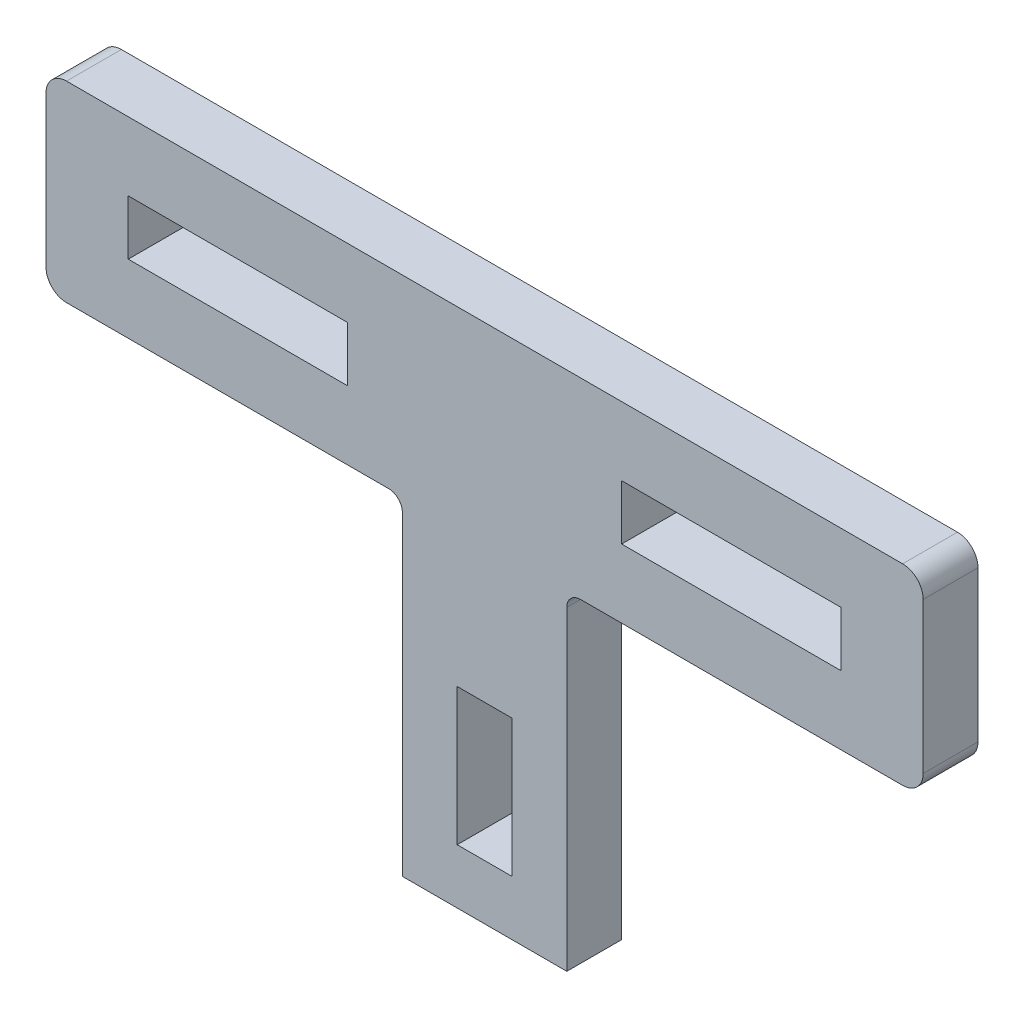
ISO-10303-21;
HEADER;
FILE_DESCRIPTION(('STEP AP214'),'2;1');
FILE_NAME('part.step','',(''),(''),'','','');
FILE_SCHEMA(('AUTOMOTIVE_DESIGN { 1 0 10303 214 1 1 1 1 }'));
ENDSEC;
DATA;
#1=APPLICATION_CONTEXT('core data for automotive mechanical design processes');
#2=APPLICATION_PROTOCOL_DEFINITION('international standard','automotive_design',2000,#1);
#3=PRODUCT_CONTEXT('',#1,'mechanical');
#4=PRODUCT('Part','Part','',(#3));
#5=PRODUCT_RELATED_PRODUCT_CATEGORY('part','',(#4));
#6=PRODUCT_DEFINITION_FORMATION('','',#4);
#7=PRODUCT_DEFINITION_CONTEXT('part definition',#1,'design');
#8=PRODUCT_DEFINITION('design','',#6,#7);
#9=PRODUCT_DEFINITION_SHAPE('','',#8);
#10=(LENGTH_UNIT() NAMED_UNIT(*) SI_UNIT(.MILLI.,.METRE.));
#11=(NAMED_UNIT(*) PLANE_ANGLE_UNIT() SI_UNIT($,.RADIAN.));
#12=(NAMED_UNIT(*) SI_UNIT($,.STERADIAN.) SOLID_ANGLE_UNIT());
#13=UNCERTAINTY_MEASURE_WITH_UNIT(LENGTH_MEASURE(1.E-05),#10,'distance_accuracy_value','');
#14=(GEOMETRIC_REPRESENTATION_CONTEXT(3) GLOBAL_UNCERTAINTY_ASSIGNED_CONTEXT((#13)) GLOBAL_UNIT_ASSIGNED_CONTEXT((#10,
#11,#12)) REPRESENTATION_CONTEXT('',''));
#15=CARTESIAN_POINT('',(0.,0.,0.));
#16=DIRECTION('',(0.,0.,1.));
#17=DIRECTION('',(1.,0.,0.));
#18=AXIS2_PLACEMENT_3D('',#15,#16,#17);
#19=CARTESIAN_POINT('',(-3.5,-4.,2.));
#20=DIRECTION('',(0.,0.,1.));
#21=DIRECTION('',(1.,0.,0.));
#22=AXIS2_PLACEMENT_3D('',#19,#20,#21);
#23=PLANE('',#22);
#24=DIRECTION('',(1.,0.,0.));
#25=VECTOR('',#24,1.);
#26=CARTESIAN_POINT('',(3.,-15.5,2.));
#27=LINE('',#26,#25);
#28=CARTESIAN_POINT('',(-3.,-15.5,2.));
#29=VERTEX_POINT('',#28);
#30=CARTESIAN_POINT('',(3.,-15.5,2.));
#31=VERTEX_POINT('',#30);
#32=EDGE_CURVE('E308',#29,#31,#27,.T.);
#33=ORIENTED_EDGE('',*,*,#32,.T.);
#34=DIRECTION('',(0.,1.,0.));
#35=VECTOR('',#34,1.);
#36=CARTESIAN_POINT('',(3.,-4.00000000000001,2.));
#37=LINE('',#36,#35);
#38=CARTESIAN_POINT('',(3.,-4.00000000000001,2.));
#39=VERTEX_POINT('',#38);
#40=EDGE_CURVE('E311',#31,#39,#37,.T.);
#41=ORIENTED_EDGE('',*,*,#40,.T.);
#42=CARTESIAN_POINT('',(3.5,-4.,2.));
#43=DIRECTION('',(0.,0.,-1.));
#44=DIRECTION('',(1.,0.,0.));
#45=AXIS2_PLACEMENT_3D('',#42,#43,#44);
#46=CIRCLE('',#45,0.5);
#47=CARTESIAN_POINT('',(3.5,-3.5,2.));
#48=VERTEX_POINT('',#47);
#49=EDGE_CURVE('E314',#39,#48,#46,.T.);
#50=ORIENTED_EDGE('',*,*,#49,.T.);
#51=DIRECTION('',(1.,0.,0.));
#52=VECTOR('',#51,1.);
#53=CARTESIAN_POINT('',(15.25,-3.5,2.));
#54=LINE('',#53,#52);
#55=CARTESIAN_POINT('',(15.25,-3.5,2.));
#56=VERTEX_POINT('',#55);
#57=EDGE_CURVE('E316',#48,#56,#54,.T.);
#58=ORIENTED_EDGE('',*,*,#57,.T.);
#59=CARTESIAN_POINT('',(15.25,-2.75,2.));
#60=DIRECTION('',(0.,0.,1.));
#61=DIRECTION('',(1.,0.,0.));
#62=AXIS2_PLACEMENT_3D('',#59,#60,#61);
#63=CIRCLE('',#62,0.75);
#64=CARTESIAN_POINT('',(16.,-2.74999999999999,2.));
#65=VERTEX_POINT('',#64);
#66=EDGE_CURVE('E318',#56,#65,#63,.T.);
#67=ORIENTED_EDGE('',*,*,#66,.T.);
#68=DIRECTION('',(0.,1.,0.));
#69=VECTOR('',#68,1.);
#70=CARTESIAN_POINT('',(16.,2.74999999999999,2.));
#71=LINE('',#70,#69);
#72=CARTESIAN_POINT('',(16.,2.74999999999999,2.));
#73=VERTEX_POINT('',#72);
#74=EDGE_CURVE('E320',#65,#73,#71,.T.);
#75=ORIENTED_EDGE('',*,*,#74,.T.);
#76=CARTESIAN_POINT('',(15.25,2.75,2.));
#77=DIRECTION('',(0.,0.,1.));
#78=DIRECTION('',(-1.,0.,0.));
#79=AXIS2_PLACEMENT_3D('',#76,#77,#78);
#80=CIRCLE('',#79,0.75);
#81=CARTESIAN_POINT('',(15.25,3.5,2.));
#82=VERTEX_POINT('',#81);
#83=EDGE_CURVE('E322',#73,#82,#80,.T.);
#84=ORIENTED_EDGE('',*,*,#83,.T.);
#85=DIRECTION('',(-1.,0.,0.));
#86=VECTOR('',#85,1.);
#87=CARTESIAN_POINT('',(15.25,3.5,2.));
#88=LINE('',#87,#86);
#89=CARTESIAN_POINT('',(-15.25,3.5,2.));
#90=VERTEX_POINT('',#89);
#91=EDGE_CURVE('E324',#82,#90,#88,.T.);
#92=ORIENTED_EDGE('',*,*,#91,.T.);
#93=CARTESIAN_POINT('',(-15.25,2.75,2.));
#94=DIRECTION('',(0.,0.,1.));
#95=DIRECTION('',(-1.,0.,0.));
#96=AXIS2_PLACEMENT_3D('',#93,#94,#95);
#97=CIRCLE('',#96,0.75);
#98=CARTESIAN_POINT('',(-16.,2.75,2.));
#99=VERTEX_POINT('',#98);
#100=EDGE_CURVE('E326',#90,#99,#97,.T.);
#101=ORIENTED_EDGE('',*,*,#100,.T.);
#102=DIRECTION('',(0.,-1.,0.));
#103=VECTOR('',#102,1.);
#104=CARTESIAN_POINT('',(-16.,2.75,2.));
#105=LINE('',#104,#103);
#106=CARTESIAN_POINT('',(-16.,-2.75,2.));
#107=VERTEX_POINT('',#106);
#108=EDGE_CURVE('E328',#99,#107,#105,.T.);
#109=ORIENTED_EDGE('',*,*,#108,.T.);
#110=CARTESIAN_POINT('',(-15.25,-2.75,2.));
#111=DIRECTION('',(0.,0.,1.));
#112=DIRECTION('',(-1.,0.,0.));
#113=AXIS2_PLACEMENT_3D('',#110,#111,#112);
#114=CIRCLE('',#113,0.75);
#115=CARTESIAN_POINT('',(-15.25,-3.5,2.));
#116=VERTEX_POINT('',#115);
#117=EDGE_CURVE('E330',#107,#116,#114,.T.);
#118=ORIENTED_EDGE('',*,*,#117,.T.);
#119=DIRECTION('',(1.,0.,0.));
#120=VECTOR('',#119,1.);
#121=CARTESIAN_POINT('',(-15.25,-3.5,2.));
#122=LINE('',#121,#120);
#123=CARTESIAN_POINT('',(-3.5,-3.5,2.));
#124=VERTEX_POINT('',#123);
#125=EDGE_CURVE('E332',#116,#124,#122,.T.);
#126=ORIENTED_EDGE('',*,*,#125,.T.);
#127=CARTESIAN_POINT('',(-3.5,-4.,2.));
#128=DIRECTION('',(0.,0.,-1.));
#129=DIRECTION('',(1.,0.,0.));
#130=AXIS2_PLACEMENT_3D('',#127,#128,#129);
#131=CIRCLE('',#130,0.5);
#132=CARTESIAN_POINT('',(-3.,-4.00000000000001,2.));
#133=VERTEX_POINT('',#132);
#134=EDGE_CURVE('E334',#124,#133,#131,.T.);
#135=ORIENTED_EDGE('',*,*,#134,.T.);
#136=DIRECTION('',(0.,-1.,0.));
#137=VECTOR('',#136,1.);
#138=CARTESIAN_POINT('',(-3.,-4.00000000000001,2.));
#139=LINE('',#138,#137);
#140=EDGE_CURVE('E336',#133,#29,#139,.T.);
#141=ORIENTED_EDGE('',*,*,#140,.T.);
#142=EDGE_LOOP('',(#33,#41,#50,#58,#67,#75,#84,#92,#101,#109,#118,#126,#135,#141));
#143=FACE_BOUND('',#142,.T.);
#144=DIRECTION('',(0.,-1.,0.));
#145=VECTOR('',#144,1.);
#146=CARTESIAN_POINT('',(-13.,1.,2.));
#147=LINE('',#146,#145);
#148=CARTESIAN_POINT('',(-13.,1.,2.));
#149=VERTEX_POINT('',#148);
#150=CARTESIAN_POINT('',(-13.,-1.,2.));
#151=VERTEX_POINT('',#150);
#152=EDGE_CURVE('E279',#149,#151,#147,.T.);
#153=ORIENTED_EDGE('',*,*,#152,.F.);
#154=DIRECTION('',(-1.,0.,0.));
#155=VECTOR('',#154,1.);
#156=CARTESIAN_POINT('',(-5.,1.,2.));
#157=LINE('',#156,#155);
#158=CARTESIAN_POINT('',(-5.,1.,2.));
#159=VERTEX_POINT('',#158);
#160=EDGE_CURVE('E277',#159,#149,#157,.T.);
#161=ORIENTED_EDGE('',*,*,#160,.F.);
#162=DIRECTION('',(0.,1.,0.));
#163=VECTOR('',#162,1.);
#164=CARTESIAN_POINT('',(-5.,1.,2.));
#165=LINE('',#164,#163);
#166=CARTESIAN_POINT('',(-5.,-1.,2.));
#167=VERTEX_POINT('',#166);
#168=EDGE_CURVE('E285',#167,#159,#165,.T.);
#169=ORIENTED_EDGE('',*,*,#168,.F.);
#170=DIRECTION('',(1.,0.,0.));
#171=VECTOR('',#170,1.);
#172=CARTESIAN_POINT('',(-5.,-1.,2.));
#173=LINE('',#172,#171);
#174=EDGE_CURVE('E282',#151,#167,#173,.T.);
#175=ORIENTED_EDGE('',*,*,#174,.F.);
#176=EDGE_LOOP('',(#153,#161,#169,#175));
#177=FACE_BOUND('',#176,.T.);
#178=DIRECTION('',(1.,0.,0.));
#179=VECTOR('',#178,1.);
#180=CARTESIAN_POINT('',(5.,-1.,2.));
#181=LINE('',#180,#179);
#182=CARTESIAN_POINT('',(5.,-1.,2.));
#183=VERTEX_POINT('',#182);
#184=CARTESIAN_POINT('',(13.,-1.,2.));
#185=VERTEX_POINT('',#184);
#186=EDGE_CURVE('E248',#183,#185,#181,.T.);
#187=ORIENTED_EDGE('',*,*,#186,.F.);
#188=DIRECTION('',(0.,-1.,0.));
#189=VECTOR('',#188,1.);
#190=CARTESIAN_POINT('',(5.,1.,2.));
#191=LINE('',#190,#189);
#192=CARTESIAN_POINT('',(5.,1.,2.));
#193=VERTEX_POINT('',#192);
#194=EDGE_CURVE('E246',#193,#183,#191,.T.);
#195=ORIENTED_EDGE('',*,*,#194,.F.);
#196=DIRECTION('',(-1.,0.,0.));
#197=VECTOR('',#196,1.);
#198=CARTESIAN_POINT('',(5.,1.,2.));
#199=LINE('',#198,#197);
#200=CARTESIAN_POINT('',(13.,1.,2.));
#201=VERTEX_POINT('',#200);
#202=EDGE_CURVE('E254',#201,#193,#199,.T.);
#203=ORIENTED_EDGE('',*,*,#202,.F.);
#204=DIRECTION('',(0.,1.,0.));
#205=VECTOR('',#204,1.);
#206=CARTESIAN_POINT('',(13.,1.,2.));
#207=LINE('',#206,#205);
#208=EDGE_CURVE('E251',#185,#201,#207,.T.);
#209=ORIENTED_EDGE('',*,*,#208,.F.);
#210=EDGE_LOOP('',(#187,#195,#203,#209));
#211=FACE_BOUND('',#210,.T.);
#212=DIRECTION('',(1.,0.,0.));
#213=VECTOR('',#212,1.);
#214=CARTESIAN_POINT('',(-0.999999999999999,-13.5,2.));
#215=LINE('',#214,#213);
#216=CARTESIAN_POINT('',(-0.999999999999999,-13.5,2.));
#217=VERTEX_POINT('',#216);
#218=CARTESIAN_POINT('',(1.,-13.5,2.));
#219=VERTEX_POINT('',#218);
#220=EDGE_CURVE('E218',#217,#219,#215,.T.);
#221=ORIENTED_EDGE('',*,*,#220,.F.);
#222=DIRECTION('',(0.,-1.,0.));
#223=VECTOR('',#222,1.);
#224=CARTESIAN_POINT('',(-0.999999999999999,-8.5,2.));
#225=LINE('',#224,#223);
#226=CARTESIAN_POINT('',(-0.999999999999999,-8.5,2.));
#227=VERTEX_POINT('',#226);
#228=EDGE_CURVE('E210',#227,#217,#225,.T.);
#229=ORIENTED_EDGE('',*,*,#228,.F.);
#230=DIRECTION('',(-1.,0.,0.));
#231=VECTOR('',#230,1.);
#232=CARTESIAN_POINT('',(-0.999999999999999,-8.5,2.));
#233=LINE('',#232,#231);
#234=CARTESIAN_POINT('',(1.,-8.5,2.));
#235=VERTEX_POINT('',#234);
#236=EDGE_CURVE('E232',#235,#227,#233,.T.);
#237=ORIENTED_EDGE('',*,*,#236,.F.);
#238=DIRECTION('',(0.,1.,0.));
#239=VECTOR('',#238,1.);
#240=CARTESIAN_POINT('',(1.,-8.5,2.));
#241=LINE('',#240,#239);
#242=EDGE_CURVE('E230',#219,#235,#241,.T.);
#243=ORIENTED_EDGE('',*,*,#242,.F.);
#244=EDGE_LOOP('',(#221,#229,#237,#243));
#245=FACE_BOUND('',#244,.T.);
#246=ADVANCED_FACE('F37',(#143,#177,#211,#245),#23,.T.);
#247=CARTESIAN_POINT('',(-3.5,-4.,0.));
#248=DIRECTION('',(0.,0.,1.));
#249=DIRECTION('',(1.,0.,0.));
#250=AXIS2_PLACEMENT_3D('',#247,#248,#249);
#251=PLANE('',#250);
#252=DIRECTION('',(0.,-1.,0.));
#253=VECTOR('',#252,1.);
#254=CARTESIAN_POINT('',(5.,1.,0.));
#255=LINE('',#254,#253);
#256=CARTESIAN_POINT('',(5.,1.,0.));
#257=VERTEX_POINT('',#256);
#258=CARTESIAN_POINT('',(5.,-1.,0.));
#259=VERTEX_POINT('',#258);
#260=EDGE_CURVE('E226',#257,#259,#255,.T.);
#261=ORIENTED_EDGE('',*,*,#260,.T.);
#262=DIRECTION('',(1.,0.,0.));
#263=VECTOR('',#262,1.);
#264=CARTESIAN_POINT('',(5.,-1.,0.));
#265=LINE('',#264,#263);
#266=CARTESIAN_POINT('',(13.,-1.,0.));
#267=VERTEX_POINT('',#266);
#268=EDGE_CURVE('E259',#259,#267,#265,.T.);
#269=ORIENTED_EDGE('',*,*,#268,.T.);
#270=DIRECTION('',(0.,1.,0.));
#271=VECTOR('',#270,1.);
#272=CARTESIAN_POINT('',(13.,1.,0.));
#273=LINE('',#272,#271);
#274=CARTESIAN_POINT('',(13.,1.,0.));
#275=VERTEX_POINT('',#274);
#276=EDGE_CURVE('E262',#267,#275,#273,.T.);
#277=ORIENTED_EDGE('',*,*,#276,.T.);
#278=DIRECTION('',(-1.,0.,0.));
#279=VECTOR('',#278,1.);
#280=CARTESIAN_POINT('',(5.,1.,0.));
#281=LINE('',#280,#279);
#282=EDGE_CURVE('E249',#275,#257,#281,.T.);
#283=ORIENTED_EDGE('',*,*,#282,.T.);
#284=EDGE_LOOP('',(#261,#269,#277,#283));
#285=FACE_BOUND('',#284,.T.);
#286=DIRECTION('',(1.,0.,0.));
#287=VECTOR('',#286,1.);
#288=CARTESIAN_POINT('',(3.,-15.5,0.));
#289=LINE('',#288,#287);
#290=CARTESIAN_POINT('',(-3.,-15.5,0.));
#291=VERTEX_POINT('',#290);
#292=CARTESIAN_POINT('',(3.,-15.5,0.));
#293=VERTEX_POINT('',#292);
#294=EDGE_CURVE('E307',#291,#293,#289,.T.);
#295=ORIENTED_EDGE('',*,*,#294,.F.);
#296=DIRECTION('',(0.,-1.,0.));
#297=VECTOR('',#296,1.);
#298=CARTESIAN_POINT('',(-3.,-4.00000000000001,0.));
#299=LINE('',#298,#297);
#300=CARTESIAN_POINT('',(-3.,-4.00000000000001,0.));
#301=VERTEX_POINT('',#300);
#302=EDGE_CURVE('E312',#301,#291,#299,.T.);
#303=ORIENTED_EDGE('',*,*,#302,.F.);
#304=CARTESIAN_POINT('',(-3.5,-4.,0.));
#305=DIRECTION('',(0.,0.,-1.));
#306=DIRECTION('',(1.,0.,0.));
#307=AXIS2_PLACEMENT_3D('',#304,#305,#306);
#308=CIRCLE('',#307,0.5);
#309=CARTESIAN_POINT('',(-3.5,-3.5,0.));
#310=VERTEX_POINT('',#309);
#311=EDGE_CURVE('E363',#310,#301,#308,.T.);
#312=ORIENTED_EDGE('',*,*,#311,.F.);
#313=DIRECTION('',(1.,0.,0.));
#314=VECTOR('',#313,1.);
#315=CARTESIAN_POINT('',(-15.25,-3.5,0.));
#316=LINE('',#315,#314);
#317=CARTESIAN_POINT('',(-15.25,-3.5,0.));
#318=VERTEX_POINT('',#317);
#319=EDGE_CURVE('E361',#318,#310,#316,.T.);
#320=ORIENTED_EDGE('',*,*,#319,.F.);
#321=CARTESIAN_POINT('',(-15.25,-2.75,0.));
#322=DIRECTION('',(0.,0.,1.));
#323=DIRECTION('',(-1.,0.,0.));
#324=AXIS2_PLACEMENT_3D('',#321,#322,#323);
#325=CIRCLE('',#324,0.75);
#326=CARTESIAN_POINT('',(-16.,-2.75,0.));
#327=VERTEX_POINT('',#326);
#328=EDGE_CURVE('E359',#327,#318,#325,.T.);
#329=ORIENTED_EDGE('',*,*,#328,.F.);
#330=DIRECTION('',(0.,-1.,0.));
#331=VECTOR('',#330,1.);
#332=CARTESIAN_POINT('',(-16.,2.75,0.));
#333=LINE('',#332,#331);
#334=CARTESIAN_POINT('',(-16.,2.75,0.));
#335=VERTEX_POINT('',#334);
#336=EDGE_CURVE('E357',#335,#327,#333,.T.);
#337=ORIENTED_EDGE('',*,*,#336,.F.);
#338=CARTESIAN_POINT('',(-15.25,2.75,0.));
#339=DIRECTION('',(0.,0.,1.));
#340=DIRECTION('',(-1.,0.,0.));
#341=AXIS2_PLACEMENT_3D('',#338,#339,#340);
#342=CIRCLE('',#341,0.75);
#343=CARTESIAN_POINT('',(-15.25,3.5,0.));
#344=VERTEX_POINT('',#343);
#345=EDGE_CURVE('E355',#344,#335,#342,.T.);
#346=ORIENTED_EDGE('',*,*,#345,.F.);
#347=DIRECTION('',(-1.,0.,0.));
#348=VECTOR('',#347,1.);
#349=CARTESIAN_POINT('',(15.25,3.5,0.));
#350=LINE('',#349,#348);
#351=CARTESIAN_POINT('',(15.25,3.5,0.));
#352=VERTEX_POINT('',#351);
#353=EDGE_CURVE('E353',#352,#344,#350,.T.);
#354=ORIENTED_EDGE('',*,*,#353,.F.);
#355=CARTESIAN_POINT('',(15.25,2.75,0.));
#356=DIRECTION('',(0.,0.,1.));
#357=DIRECTION('',(-1.,0.,0.));
#358=AXIS2_PLACEMENT_3D('',#355,#356,#357);
#359=CIRCLE('',#358,0.75);
#360=CARTESIAN_POINT('',(16.,2.74999999999999,0.));
#361=VERTEX_POINT('',#360);
#362=EDGE_CURVE('E351',#361,#352,#359,.T.);
#363=ORIENTED_EDGE('',*,*,#362,.F.);
#364=DIRECTION('',(0.,1.,0.));
#365=VECTOR('',#364,1.);
#366=CARTESIAN_POINT('',(16.,2.74999999999999,0.));
#367=LINE('',#366,#365);
#368=CARTESIAN_POINT('',(16.,-2.74999999999999,0.));
#369=VERTEX_POINT('',#368);
#370=EDGE_CURVE('E349',#369,#361,#367,.T.);
#371=ORIENTED_EDGE('',*,*,#370,.F.);
#372=CARTESIAN_POINT('',(15.25,-2.75,0.));
#373=DIRECTION('',(0.,0.,1.));
#374=DIRECTION('',(1.,0.,0.));
#375=AXIS2_PLACEMENT_3D('',#372,#373,#374);
#376=CIRCLE('',#375,0.75);
#377=CARTESIAN_POINT('',(15.25,-3.5,0.));
#378=VERTEX_POINT('',#377);
#379=EDGE_CURVE('E347',#378,#369,#376,.T.);
#380=ORIENTED_EDGE('',*,*,#379,.F.);
#381=DIRECTION('',(1.,0.,0.));
#382=VECTOR('',#381,1.);
#383=CARTESIAN_POINT('',(15.25,-3.5,0.));
#384=LINE('',#383,#382);
#385=CARTESIAN_POINT('',(3.5,-3.5,0.));
#386=VERTEX_POINT('',#385);
#387=EDGE_CURVE('E345',#386,#378,#384,.T.);
#388=ORIENTED_EDGE('',*,*,#387,.F.);
#389=CARTESIAN_POINT('',(3.5,-4.,0.));
#390=DIRECTION('',(0.,0.,-1.));
#391=DIRECTION('',(1.,0.,0.));
#392=AXIS2_PLACEMENT_3D('',#389,#390,#391);
#393=CIRCLE('',#392,0.5);
#394=CARTESIAN_POINT('',(3.,-4.00000000000001,0.));
#395=VERTEX_POINT('',#394);
#396=EDGE_CURVE('E343',#395,#386,#393,.T.);
#397=ORIENTED_EDGE('',*,*,#396,.F.);
#398=DIRECTION('',(0.,1.,0.));
#399=VECTOR('',#398,1.);
#400=CARTESIAN_POINT('',(3.,-4.00000000000001,0.));
#401=LINE('',#400,#399);
#402=EDGE_CURVE('E341',#293,#395,#401,.T.);
#403=ORIENTED_EDGE('',*,*,#402,.F.);
#404=EDGE_LOOP('',(#295,#303,#312,#320,#329,#337,#346,#354,#363,#371,#380,#388,#397,#403));
#405=FACE_BOUND('',#404,.T.);
#406=DIRECTION('',(-1.,0.,0.));
#407=VECTOR('',#406,1.);
#408=CARTESIAN_POINT('',(-5.,1.,0.));
#409=LINE('',#408,#407);
#410=CARTESIAN_POINT('',(-5.,1.,0.));
#411=VERTEX_POINT('',#410);
#412=CARTESIAN_POINT('',(-13.,1.,0.));
#413=VERTEX_POINT('',#412);
#414=EDGE_CURVE('E276',#411,#413,#409,.T.);
#415=ORIENTED_EDGE('',*,*,#414,.T.);
#416=DIRECTION('',(0.,-1.,0.));
#417=VECTOR('',#416,1.);
#418=CARTESIAN_POINT('',(-13.,1.,0.));
#419=LINE('',#418,#417);
#420=CARTESIAN_POINT('',(-13.,-1.,0.));
#421=VERTEX_POINT('',#420);
#422=EDGE_CURVE('E290',#413,#421,#419,.T.);
#423=ORIENTED_EDGE('',*,*,#422,.T.);
#424=DIRECTION('',(1.,0.,0.));
#425=VECTOR('',#424,1.);
#426=CARTESIAN_POINT('',(-5.,-1.,0.));
#427=LINE('',#426,#425);
#428=CARTESIAN_POINT('',(-5.,-1.,0.));
#429=VERTEX_POINT('',#428);
#430=EDGE_CURVE('E293',#421,#429,#427,.T.);
#431=ORIENTED_EDGE('',*,*,#430,.T.);
#432=DIRECTION('',(0.,1.,0.));
#433=VECTOR('',#432,1.);
#434=CARTESIAN_POINT('',(-5.,1.,0.));
#435=LINE('',#434,#433);
#436=EDGE_CURVE('E280',#429,#411,#435,.T.);
#437=ORIENTED_EDGE('',*,*,#436,.T.);
#438=EDGE_LOOP('',(#415,#423,#431,#437));
#439=FACE_BOUND('',#438,.T.);
#440=DIRECTION('',(0.,-1.,0.));
#441=VECTOR('',#440,1.);
#442=CARTESIAN_POINT('',(-0.999999999999999,-8.5,0.));
#443=LINE('',#442,#441);
#444=CARTESIAN_POINT('',(-0.999999999999999,-8.5,0.));
#445=VERTEX_POINT('',#444);
#446=CARTESIAN_POINT('',(-0.999999999999999,-13.5,0.));
#447=VERTEX_POINT('',#446);
#448=EDGE_CURVE('E60',#445,#447,#443,.T.);
#449=ORIENTED_EDGE('',*,*,#448,.T.);
#450=DIRECTION('',(1.,0.,0.));
#451=VECTOR('',#450,1.);
#452=CARTESIAN_POINT('',(-0.999999999999999,-13.5,0.));
#453=LINE('',#452,#451);
#454=CARTESIAN_POINT('',(1.,-13.5,0.));
#455=VERTEX_POINT('',#454);
#456=EDGE_CURVE('E225',#447,#455,#453,.T.);
#457=ORIENTED_EDGE('',*,*,#456,.T.);
#458=DIRECTION('',(0.,1.,0.));
#459=VECTOR('',#458,1.);
#460=CARTESIAN_POINT('',(1.,-8.5,0.));
#461=LINE('',#460,#459);
#462=CARTESIAN_POINT('',(1.,-8.5,0.));
#463=VERTEX_POINT('',#462);
#464=EDGE_CURVE('E238',#455,#463,#461,.T.);
#465=ORIENTED_EDGE('',*,*,#464,.T.);
#466=DIRECTION('',(-1.,0.,0.));
#467=VECTOR('',#466,1.);
#468=CARTESIAN_POINT('',(-0.999999999999999,-8.5,0.));
#469=LINE('',#468,#467);
#470=EDGE_CURVE('E219',#463,#445,#469,.T.);
#471=ORIENTED_EDGE('',*,*,#470,.T.);
#472=EDGE_LOOP('',(#449,#457,#465,#471));
#473=FACE_BOUND('',#472,.T.);
#474=ADVANCED_FACE('F411',(#285,#405,#439,#473),#251,.F.);
#475=CARTESIAN_POINT('',(3.,-15.5,2.));
#476=DIRECTION('',(0.,1.,0.));
#477=DIRECTION('',(0.,0.,1.));
#478=AXIS2_PLACEMENT_3D('',#475,#476,#477);
#479=PLANE('',#478);
#480=ORIENTED_EDGE('',*,*,#294,.T.);
#481=DIRECTION('',(0.,0.,-1.));
#482=VECTOR('',#481,1.);
#483=CARTESIAN_POINT('',(3.,-15.5,2.));
#484=LINE('',#483,#482);
#485=EDGE_CURVE('E11',#31,#293,#484,.T.);
#486=ORIENTED_EDGE('',*,*,#485,.F.);
#487=ORIENTED_EDGE('',*,*,#32,.F.);
#488=DIRECTION('',(0.,0.,-1.));
#489=VECTOR('',#488,1.);
#490=CARTESIAN_POINT('',(-3.,-15.5,2.));
#491=LINE('',#490,#489);
#492=EDGE_CURVE('E338',#29,#291,#491,.T.);
#493=ORIENTED_EDGE('',*,*,#492,.T.);
#494=EDGE_LOOP('',(#480,#486,#487,#493));
#495=FACE_BOUND('',#494,.T.);
#496=ADVANCED_FACE('F39',(#495),#479,.F.);
#497=CARTESIAN_POINT('',(3.,-4.00000000000001,2.));
#498=DIRECTION('',(-1.,0.,0.));
#499=DIRECTION('',(0.,-1.,0.));
#500=AXIS2_PLACEMENT_3D('',#497,#498,#499);
#501=PLANE('',#500);
#502=ORIENTED_EDGE('',*,*,#402,.T.);
#503=DIRECTION('',(0.,0.,-1.));
#504=VECTOR('',#503,1.);
#505=CARTESIAN_POINT('',(3.,-4.00000000000001,2.));
#506=LINE('',#505,#504);
#507=EDGE_CURVE('E45',#39,#395,#506,.T.);
#508=ORIENTED_EDGE('',*,*,#507,.F.);
#509=ORIENTED_EDGE('',*,*,#40,.F.);
#510=ORIENTED_EDGE('',*,*,#485,.T.);
#511=EDGE_LOOP('',(#502,#508,#509,#510));
#512=FACE_BOUND('',#511,.T.);
#513=ADVANCED_FACE('F429',(#512),#501,.F.);
#514=CARTESIAN_POINT('',(3.5,-4.,2.));
#515=DIRECTION('',(0.,0.,-1.));
#516=DIRECTION('',(-1.,0.,0.));
#517=AXIS2_PLACEMENT_3D('',#514,#515,#516);
#518=CYLINDRICAL_SURFACE('',#517,0.5);
#519=ORIENTED_EDGE('',*,*,#396,.T.);
#520=DIRECTION('',(0.,0.,-1.));
#521=VECTOR('',#520,1.);
#522=CARTESIAN_POINT('',(3.5,-3.5,2.));
#523=LINE('',#522,#521);
#524=EDGE_CURVE('E398',#48,#386,#523,.T.);
#525=ORIENTED_EDGE('',*,*,#524,.F.);
#526=ORIENTED_EDGE('',*,*,#49,.F.);
#527=ORIENTED_EDGE('',*,*,#507,.T.);
#528=EDGE_LOOP('',(#519,#525,#526,#527));
#529=FACE_BOUND('',#528,.T.);
#530=ADVANCED_FACE('F405',(#529),#518,.F.);
#531=CARTESIAN_POINT('',(15.25,-3.5,2.));
#532=DIRECTION('',(0.,1.,0.));
#533=DIRECTION('',(-1.,0.,0.));
#534=AXIS2_PLACEMENT_3D('',#531,#532,#533);
#535=PLANE('',#534);
#536=ORIENTED_EDGE('',*,*,#387,.T.);
#537=DIRECTION('',(0.,0.,-1.));
#538=VECTOR('',#537,1.);
#539=CARTESIAN_POINT('',(15.25,-3.5,2.));
#540=LINE('',#539,#538);
#541=EDGE_CURVE('E395',#56,#378,#540,.T.);
#542=ORIENTED_EDGE('',*,*,#541,.F.);
#543=ORIENTED_EDGE('',*,*,#57,.F.);
#544=ORIENTED_EDGE('',*,*,#524,.T.);
#545=EDGE_LOOP('',(#536,#542,#543,#544));
#546=FACE_BOUND('',#545,.T.);
#547=ADVANCED_FACE('F417',(#546),#535,.F.);
#548=CARTESIAN_POINT('',(15.25,-2.75,2.));
#549=DIRECTION('',(0.,0.,-1.));
#550=DIRECTION('',(-1.,0.,0.));
#551=AXIS2_PLACEMENT_3D('',#548,#549,#550);
#552=CYLINDRICAL_SURFACE('',#551,0.75);
#553=ORIENTED_EDGE('',*,*,#379,.T.);
#554=DIRECTION('',(0.,0.,-1.));
#555=VECTOR('',#554,1.);
#556=CARTESIAN_POINT('',(16.,-2.74999999999999,2.));
#557=LINE('',#556,#555);
#558=EDGE_CURVE('E392',#65,#369,#557,.T.);
#559=ORIENTED_EDGE('',*,*,#558,.F.);
#560=ORIENTED_EDGE('',*,*,#66,.F.);
#561=ORIENTED_EDGE('',*,*,#541,.T.);
#562=EDGE_LOOP('',(#553,#559,#560,#561));
#563=FACE_BOUND('',#562,.T.);
#564=ADVANCED_FACE('F421',(#563),#552,.T.);
#565=CARTESIAN_POINT('',(16.,2.74999999999999,2.));
#566=DIRECTION('',(-1.,0.,0.));
#567=DIRECTION('',(0.,0.,1.));
#568=AXIS2_PLACEMENT_3D('',#565,#566,#567);
#569=PLANE('',#568);
#570=ORIENTED_EDGE('',*,*,#370,.T.);
#571=DIRECTION('',(0.,0.,-1.));
#572=VECTOR('',#571,1.);
#573=CARTESIAN_POINT('',(16.,2.74999999999999,2.));
#574=LINE('',#573,#572);
#575=EDGE_CURVE('E389',#73,#361,#574,.T.);
#576=ORIENTED_EDGE('',*,*,#575,.F.);
#577=ORIENTED_EDGE('',*,*,#74,.F.);
#578=ORIENTED_EDGE('',*,*,#558,.T.);
#579=EDGE_LOOP('',(#570,#576,#577,#578));
#580=FACE_BOUND('',#579,.T.);
#581=ADVANCED_FACE('F472',(#580),#569,.F.);
#582=CARTESIAN_POINT('',(15.25,2.75,2.));
#583=DIRECTION('',(0.,0.,-1.));
#584=DIRECTION('',(-1.,0.,0.));
#585=AXIS2_PLACEMENT_3D('',#582,#583,#584);
#586=CYLINDRICAL_SURFACE('',#585,0.75);
#587=ORIENTED_EDGE('',*,*,#362,.T.);
#588=DIRECTION('',(0.,0.,-1.));
#589=VECTOR('',#588,1.);
#590=CARTESIAN_POINT('',(15.25,3.5,2.));
#591=LINE('',#590,#589);
#592=EDGE_CURVE('E386',#82,#352,#591,.T.);
#593=ORIENTED_EDGE('',*,*,#592,.F.);
#594=ORIENTED_EDGE('',*,*,#83,.F.);
#595=ORIENTED_EDGE('',*,*,#575,.T.);
#596=EDGE_LOOP('',(#587,#593,#594,#595));
#597=FACE_BOUND('',#596,.T.);
#598=ADVANCED_FACE('F470',(#597),#586,.T.);
#599=CARTESIAN_POINT('',(15.25,3.5,2.));
#600=DIRECTION('',(0.,-1.,0.));
#601=DIRECTION('',(1.,0.,0.));
#602=AXIS2_PLACEMENT_3D('',#599,#600,#601);
#603=PLANE('',#602);
#604=ORIENTED_EDGE('',*,*,#353,.T.);
#605=DIRECTION('',(0.,0.,-1.));
#606=VECTOR('',#605,1.);
#607=CARTESIAN_POINT('',(-15.25,3.5,2.));
#608=LINE('',#607,#606);
#609=EDGE_CURVE('E383',#90,#344,#608,.T.);
#610=ORIENTED_EDGE('',*,*,#609,.F.);
#611=ORIENTED_EDGE('',*,*,#91,.F.);
#612=ORIENTED_EDGE('',*,*,#592,.T.);
#613=EDGE_LOOP('',(#604,#610,#611,#612));
#614=FACE_BOUND('',#613,.T.);
#615=ADVANCED_FACE('F465',(#614),#603,.F.);
#616=CARTESIAN_POINT('',(-15.25,2.75,2.));
#617=DIRECTION('',(0.,0.,-1.));
#618=DIRECTION('',(-1.,0.,0.));
#619=AXIS2_PLACEMENT_3D('',#616,#617,#618);
#620=CYLINDRICAL_SURFACE('',#619,0.75);
#621=ORIENTED_EDGE('',*,*,#345,.T.);
#622=DIRECTION('',(0.,0.,-1.));
#623=VECTOR('',#622,1.);
#624=CARTESIAN_POINT('',(-16.,2.75,2.));
#625=LINE('',#624,#623);
#626=EDGE_CURVE('E380',#99,#335,#625,.T.);
#627=ORIENTED_EDGE('',*,*,#626,.F.);
#628=ORIENTED_EDGE('',*,*,#100,.F.);
#629=ORIENTED_EDGE('',*,*,#609,.T.);
#630=EDGE_LOOP('',(#621,#627,#628,#629));
#631=FACE_BOUND('',#630,.T.);
#632=ADVANCED_FACE('F460',(#631),#620,.T.);
#633=CARTESIAN_POINT('',(-16.,2.75,2.));
#634=DIRECTION('',(1.,0.,0.));
#635=DIRECTION('',(0.,0.,-1.));
#636=AXIS2_PLACEMENT_3D('',#633,#634,#635);
#637=PLANE('',#636);
#638=ORIENTED_EDGE('',*,*,#336,.T.);
#639=DIRECTION('',(0.,0.,-1.));
#640=VECTOR('',#639,1.);
#641=CARTESIAN_POINT('',(-16.,-2.75,2.));
#642=LINE('',#641,#640);
#643=EDGE_CURVE('E377',#107,#327,#642,.T.);
#644=ORIENTED_EDGE('',*,*,#643,.F.);
#645=ORIENTED_EDGE('',*,*,#108,.F.);
#646=ORIENTED_EDGE('',*,*,#626,.T.);
#647=EDGE_LOOP('',(#638,#644,#645,#646));
#648=FACE_BOUND('',#647,.T.);
#649=ADVANCED_FACE('F456',(#648),#637,.F.);
#650=CARTESIAN_POINT('',(-15.25,-2.75,2.));
#651=DIRECTION('',(0.,0.,-1.));
#652=DIRECTION('',(-1.,0.,0.));
#653=AXIS2_PLACEMENT_3D('',#650,#651,#652);
#654=CYLINDRICAL_SURFACE('',#653,0.75);
#655=ORIENTED_EDGE('',*,*,#328,.T.);
#656=DIRECTION('',(0.,0.,-1.));
#657=VECTOR('',#656,1.);
#658=CARTESIAN_POINT('',(-15.25,-3.5,2.));
#659=LINE('',#658,#657);
#660=EDGE_CURVE('E374',#116,#318,#659,.T.);
#661=ORIENTED_EDGE('',*,*,#660,.F.);
#662=ORIENTED_EDGE('',*,*,#117,.F.);
#663=ORIENTED_EDGE('',*,*,#643,.T.);
#664=EDGE_LOOP('',(#655,#661,#662,#663));
#665=FACE_BOUND('',#664,.T.);
#666=ADVANCED_FACE('F451',(#665),#654,.T.);
#667=CARTESIAN_POINT('',(-15.25,-3.5,2.));
#668=DIRECTION('',(0.,1.,0.));
#669=DIRECTION('',(-1.,0.,0.));
#670=AXIS2_PLACEMENT_3D('',#667,#668,#669);
#671=PLANE('',#670);
#672=ORIENTED_EDGE('',*,*,#319,.T.);
#673=DIRECTION('',(0.,0.,-1.));
#674=VECTOR('',#673,1.);
#675=CARTESIAN_POINT('',(-3.5,-3.5,2.));
#676=LINE('',#675,#674);
#677=EDGE_CURVE('E371',#124,#310,#676,.T.);
#678=ORIENTED_EDGE('',*,*,#677,.F.);
#679=ORIENTED_EDGE('',*,*,#125,.F.);
#680=ORIENTED_EDGE('',*,*,#660,.T.);
#681=EDGE_LOOP('',(#672,#678,#679,#680));
#682=FACE_BOUND('',#681,.T.);
#683=ADVANCED_FACE('F445',(#682),#671,.F.);
#684=CARTESIAN_POINT('',(-3.5,-4.,2.));
#685=DIRECTION('',(0.,0.,-1.));
#686=DIRECTION('',(-1.,0.,0.));
#687=AXIS2_PLACEMENT_3D('',#684,#685,#686);
#688=CYLINDRICAL_SURFACE('',#687,0.5);
#689=ORIENTED_EDGE('',*,*,#311,.T.);
#690=DIRECTION('',(0.,0.,-1.));
#691=VECTOR('',#690,1.);
#692=CARTESIAN_POINT('',(-3.,-4.00000000000001,2.));
#693=LINE('',#692,#691);
#694=EDGE_CURVE('E368',#133,#301,#693,.T.);
#695=ORIENTED_EDGE('',*,*,#694,.F.);
#696=ORIENTED_EDGE('',*,*,#134,.F.);
#697=ORIENTED_EDGE('',*,*,#677,.T.);
#698=EDGE_LOOP('',(#689,#695,#696,#697));
#699=FACE_BOUND('',#698,.T.);
#700=ADVANCED_FACE('F441',(#699),#688,.F.);
#701=CARTESIAN_POINT('',(-3.,-4.00000000000001,2.));
#702=DIRECTION('',(1.,0.,0.));
#703=DIRECTION('',(0.,1.,0.));
#704=AXIS2_PLACEMENT_3D('',#701,#702,#703);
#705=PLANE('',#704);
#706=ORIENTED_EDGE('',*,*,#302,.T.);
#707=ORIENTED_EDGE('',*,*,#492,.F.);
#708=ORIENTED_EDGE('',*,*,#140,.F.);
#709=ORIENTED_EDGE('',*,*,#694,.T.);
#710=EDGE_LOOP('',(#706,#707,#708,#709));
#711=FACE_BOUND('',#710,.T.);
#712=ADVANCED_FACE('F436',(#711),#705,.F.);
#713=CARTESIAN_POINT('',(-5.,1.,2.));
#714=DIRECTION('',(0.,-1.,0.));
#715=DIRECTION('',(0.,0.,-1.));
#716=AXIS2_PLACEMENT_3D('',#713,#714,#715);
#717=PLANE('',#716);
#718=ORIENTED_EDGE('',*,*,#414,.F.);
#719=DIRECTION('',(0.,0.,-1.));
#720=VECTOR('',#719,1.);
#721=CARTESIAN_POINT('',(-5.,1.,2.));
#722=LINE('',#721,#720);
#723=EDGE_CURVE('E287',#159,#411,#722,.T.);
#724=ORIENTED_EDGE('',*,*,#723,.F.);
#725=ORIENTED_EDGE('',*,*,#160,.T.);
#726=DIRECTION('',(0.,0.,-1.));
#727=VECTOR('',#726,1.);
#728=CARTESIAN_POINT('',(-13.,1.,2.));
#729=LINE('',#728,#727);
#730=EDGE_CURVE('E304',#149,#413,#729,.T.);
#731=ORIENTED_EDGE('',*,*,#730,.T.);
#732=EDGE_LOOP('',(#718,#724,#725,#731));
#733=FACE_BOUND('',#732,.T.);
#734=ADVANCED_FACE('F489',(#733),#717,.T.);
#735=CARTESIAN_POINT('',(-13.,1.,2.));
#736=DIRECTION('',(1.,0.,0.));
#737=DIRECTION('',(0.,0.,-1.));
#738=AXIS2_PLACEMENT_3D('',#735,#736,#737);
#739=PLANE('',#738);
#740=ORIENTED_EDGE('',*,*,#422,.F.);
#741=ORIENTED_EDGE('',*,*,#730,.F.);
#742=ORIENTED_EDGE('',*,*,#152,.T.);
#743=DIRECTION('',(0.,0.,-1.));
#744=VECTOR('',#743,1.);
#745=CARTESIAN_POINT('',(-13.,-1.,2.));
#746=LINE('',#745,#744);
#747=EDGE_CURVE('E302',#151,#421,#746,.T.);
#748=ORIENTED_EDGE('',*,*,#747,.T.);
#749=EDGE_LOOP('',(#740,#741,#742,#748));
#750=FACE_BOUND('',#749,.T.);
#751=ADVANCED_FACE('F539',(#750),#739,.T.);
#752=CARTESIAN_POINT('',(-5.,-1.,2.));
#753=DIRECTION('',(0.,1.,0.));
#754=DIRECTION('',(-1.,0.,0.));
#755=AXIS2_PLACEMENT_3D('',#752,#753,#754);
#756=PLANE('',#755);
#757=ORIENTED_EDGE('',*,*,#430,.F.);
#758=ORIENTED_EDGE('',*,*,#747,.F.);
#759=ORIENTED_EDGE('',*,*,#174,.T.);
#760=DIRECTION('',(0.,0.,-1.));
#761=VECTOR('',#760,1.);
#762=CARTESIAN_POINT('',(-5.,-1.,2.));
#763=LINE('',#762,#761);
#764=EDGE_CURVE('E300',#167,#429,#763,.T.);
#765=ORIENTED_EDGE('',*,*,#764,.T.);
#766=EDGE_LOOP('',(#757,#758,#759,#765));
#767=FACE_BOUND('',#766,.T.);
#768=ADVANCED_FACE('F546',(#767),#756,.T.);
#769=CARTESIAN_POINT('',(-5.,1.,2.));
#770=DIRECTION('',(-1.,0.,0.));
#771=DIRECTION('',(0.,0.,1.));
#772=AXIS2_PLACEMENT_3D('',#769,#770,#771);
#773=PLANE('',#772);
#774=ORIENTED_EDGE('',*,*,#436,.F.);
#775=ORIENTED_EDGE('',*,*,#764,.F.);
#776=ORIENTED_EDGE('',*,*,#168,.T.);
#777=ORIENTED_EDGE('',*,*,#723,.T.);
#778=EDGE_LOOP('',(#774,#775,#776,#777));
#779=FACE_BOUND('',#778,.T.);
#780=ADVANCED_FACE('F553',(#779),#773,.T.);
#781=CARTESIAN_POINT('',(5.,1.,2.));
#782=DIRECTION('',(1.,0.,0.));
#783=DIRECTION('',(0.,0.,-1.));
#784=AXIS2_PLACEMENT_3D('',#781,#782,#783);
#785=PLANE('',#784);
#786=ORIENTED_EDGE('',*,*,#260,.F.);
#787=DIRECTION('',(0.,0.,-1.));
#788=VECTOR('',#787,1.);
#789=CARTESIAN_POINT('',(5.,1.,2.));
#790=LINE('',#789,#788);
#791=EDGE_CURVE('E256',#193,#257,#790,.T.);
#792=ORIENTED_EDGE('',*,*,#791,.F.);
#793=ORIENTED_EDGE('',*,*,#194,.T.);
#794=DIRECTION('',(0.,0.,-1.));
#795=VECTOR('',#794,1.);
#796=CARTESIAN_POINT('',(5.,-1.,2.));
#797=LINE('',#796,#795);
#798=EDGE_CURVE('E273',#183,#259,#797,.T.);
#799=ORIENTED_EDGE('',*,*,#798,.T.);
#800=EDGE_LOOP('',(#786,#792,#793,#799));
#801=FACE_BOUND('',#800,.T.);
#802=ADVANCED_FACE('F561',(#801),#785,.T.);
#803=CARTESIAN_POINT('',(5.,-1.,2.));
#804=DIRECTION('',(0.,1.,0.));
#805=DIRECTION('',(-1.,0.,0.));
#806=AXIS2_PLACEMENT_3D('',#803,#804,#805);
#807=PLANE('',#806);
#808=ORIENTED_EDGE('',*,*,#268,.F.);
#809=ORIENTED_EDGE('',*,*,#798,.F.);
#810=ORIENTED_EDGE('',*,*,#186,.T.);
#811=DIRECTION('',(0.,0.,-1.));
#812=VECTOR('',#811,1.);
#813=CARTESIAN_POINT('',(13.,-1.,2.));
#814=LINE('',#813,#812);
#815=EDGE_CURVE('E271',#185,#267,#814,.T.);
#816=ORIENTED_EDGE('',*,*,#815,.T.);
#817=EDGE_LOOP('',(#808,#809,#810,#816));
#818=FACE_BOUND('',#817,.T.);
#819=ADVANCED_FACE('F569',(#818),#807,.T.);
#820=CARTESIAN_POINT('',(13.,1.,2.));
#821=DIRECTION('',(-1.,0.,0.));
#822=DIRECTION('',(0.,0.,1.));
#823=AXIS2_PLACEMENT_3D('',#820,#821,#822);
#824=PLANE('',#823);
#825=ORIENTED_EDGE('',*,*,#276,.F.);
#826=ORIENTED_EDGE('',*,*,#815,.F.);
#827=ORIENTED_EDGE('',*,*,#208,.T.);
#828=DIRECTION('',(0.,0.,-1.));
#829=VECTOR('',#828,1.);
#830=CARTESIAN_POINT('',(13.,1.,2.));
#831=LINE('',#830,#829);
#832=EDGE_CURVE('E269',#201,#275,#831,.T.);
#833=ORIENTED_EDGE('',*,*,#832,.T.);
#834=EDGE_LOOP('',(#825,#826,#827,#833));
#835=FACE_BOUND('',#834,.T.);
#836=ADVANCED_FACE('F577',(#835),#824,.T.);
#837=CARTESIAN_POINT('',(5.,1.,2.));
#838=DIRECTION('',(0.,-1.,0.));
#839=DIRECTION('',(0.,0.,-1.));
#840=AXIS2_PLACEMENT_3D('',#837,#838,#839);
#841=PLANE('',#840);
#842=ORIENTED_EDGE('',*,*,#282,.F.);
#843=ORIENTED_EDGE('',*,*,#832,.F.);
#844=ORIENTED_EDGE('',*,*,#202,.T.);
#845=ORIENTED_EDGE('',*,*,#791,.T.);
#846=EDGE_LOOP('',(#842,#843,#844,#845));
#847=FACE_BOUND('',#846,.T.);
#848=ADVANCED_FACE('F585',(#847),#841,.T.);
#849=CARTESIAN_POINT('',(-0.999999999999999,-8.5,2.));
#850=DIRECTION('',(1.,0.,0.));
#851=DIRECTION('',(0.,1.,0.));
#852=AXIS2_PLACEMENT_3D('',#849,#850,#851);
#853=PLANE('',#852);
#854=ORIENTED_EDGE('',*,*,#448,.F.);
#855=DIRECTION('',(0.,0.,-1.));
#856=VECTOR('',#855,1.);
#857=CARTESIAN_POINT('',(-0.999999999999999,-8.5,2.));
#858=LINE('',#857,#856);
#859=EDGE_CURVE('E214',#227,#445,#858,.T.);
#860=ORIENTED_EDGE('',*,*,#859,.F.);
#861=ORIENTED_EDGE('',*,*,#228,.T.);
#862=DIRECTION('',(0.,0.,-1.));
#863=VECTOR('',#862,1.);
#864=CARTESIAN_POINT('',(-0.999999999999999,-13.5,2.));
#865=LINE('',#864,#863);
#866=EDGE_CURVE('E213',#217,#447,#865,.T.);
#867=ORIENTED_EDGE('',*,*,#866,.T.);
#868=EDGE_LOOP('',(#854,#860,#861,#867));
#869=FACE_BOUND('',#868,.T.);
#870=ADVANCED_FACE('F212',(#869),#853,.T.);
#871=CARTESIAN_POINT('',(-0.999999999999999,-13.5,2.));
#872=DIRECTION('',(0.,1.,0.));
#873=DIRECTION('',(0.,0.,1.));
#874=AXIS2_PLACEMENT_3D('',#871,#872,#873);
#875=PLANE('',#874);
#876=ORIENTED_EDGE('',*,*,#456,.F.);
#877=ORIENTED_EDGE('',*,*,#866,.F.);
#878=ORIENTED_EDGE('',*,*,#220,.T.);
#879=DIRECTION('',(0.,0.,-1.));
#880=VECTOR('',#879,1.);
#881=CARTESIAN_POINT('',(1.,-13.5,2.));
#882=LINE('',#881,#880);
#883=EDGE_CURVE('E227',#219,#455,#882,.T.);
#884=ORIENTED_EDGE('',*,*,#883,.T.);
#885=EDGE_LOOP('',(#876,#877,#878,#884));
#886=FACE_BOUND('',#885,.T.);
#887=ADVANCED_FACE('F222',(#886),#875,.T.);
#888=CARTESIAN_POINT('',(1.,-8.5,2.));
#889=DIRECTION('',(-1.,0.,0.));
#890=DIRECTION('',(0.,-1.,0.));
#891=AXIS2_PLACEMENT_3D('',#888,#889,#890);
#892=PLANE('',#891);
#893=ORIENTED_EDGE('',*,*,#464,.F.);
#894=ORIENTED_EDGE('',*,*,#883,.F.);
#895=ORIENTED_EDGE('',*,*,#242,.T.);
#896=DIRECTION('',(0.,0.,-1.));
#897=VECTOR('',#896,1.);
#898=CARTESIAN_POINT('',(1.,-8.5,2.));
#899=LINE('',#898,#897);
#900=EDGE_CURVE('E52',#235,#463,#899,.T.);
#901=ORIENTED_EDGE('',*,*,#900,.T.);
#902=EDGE_LOOP('',(#893,#894,#895,#901));
#903=FACE_BOUND('',#902,.T.);
#904=ADVANCED_FACE('F606',(#903),#892,.T.);
#905=CARTESIAN_POINT('',(-0.999999999999999,-8.5,2.));
#906=DIRECTION('',(0.,-1.,0.));
#907=DIRECTION('',(0.,0.,-1.));
#908=AXIS2_PLACEMENT_3D('',#905,#906,#907);
#909=PLANE('',#908);
#910=ORIENTED_EDGE('',*,*,#470,.F.);
#911=ORIENTED_EDGE('',*,*,#900,.F.);
#912=ORIENTED_EDGE('',*,*,#236,.T.);
#913=ORIENTED_EDGE('',*,*,#859,.T.);
#914=EDGE_LOOP('',(#910,#911,#912,#913));
#915=FACE_BOUND('',#914,.T.);
#916=ADVANCED_FACE('F613',(#915),#909,.T.);
#917=CLOSED_SHELL('',(#246,#474,#496,#513,#530,#547,#564,#581,#598,#615,#632,#649,#666,#683,
#700,#712,#734,#751,#768,#780,#802,#819,#836,#848,#870,#887,#904,#916));
#918=MANIFOLD_SOLID_BREP('B2',#917);
#919=ADVANCED_BREP_SHAPE_REPRESENTATION('',(#18,#918),#14);
#920=SHAPE_DEFINITION_REPRESENTATION(#9,#919);
ENDSEC;
END-ISO-10303-21;
